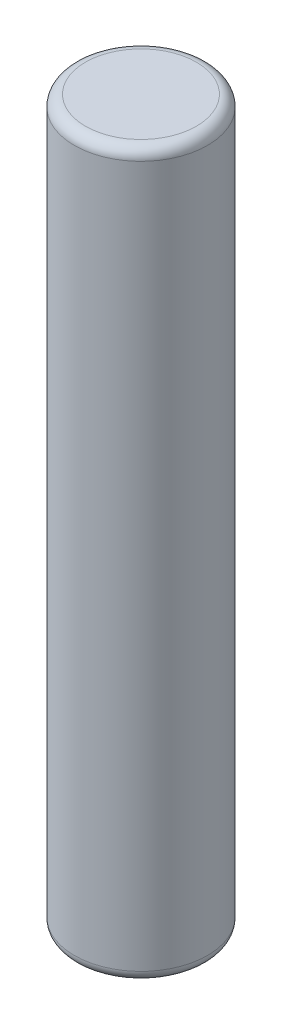
ISO-10303-21;
HEADER;
FILE_DESCRIPTION(('STEP AP214'),'2;1');
FILE_NAME('part.step','',(''),(''),'','','');
FILE_SCHEMA(('AUTOMOTIVE_DESIGN { 1 0 10303 214 1 1 1 1 }'));
ENDSEC;
DATA;
#1=APPLICATION_CONTEXT('core data for automotive mechanical design processes');
#2=APPLICATION_PROTOCOL_DEFINITION('international standard','automotive_design',2000,#1);
#3=PRODUCT_CONTEXT('',#1,'mechanical');
#4=PRODUCT('Part','Part','',(#3));
#5=PRODUCT_RELATED_PRODUCT_CATEGORY('part','',(#4));
#6=PRODUCT_DEFINITION_FORMATION('','',#4);
#7=PRODUCT_DEFINITION_CONTEXT('part definition',#1,'design');
#8=PRODUCT_DEFINITION('design','',#6,#7);
#9=PRODUCT_DEFINITION_SHAPE('','',#8);
#10=(LENGTH_UNIT() NAMED_UNIT(*) SI_UNIT(.MILLI.,.METRE.));
#11=(NAMED_UNIT(*) PLANE_ANGLE_UNIT() SI_UNIT($,.RADIAN.));
#12=(NAMED_UNIT(*) SI_UNIT($,.STERADIAN.) SOLID_ANGLE_UNIT());
#13=UNCERTAINTY_MEASURE_WITH_UNIT(LENGTH_MEASURE(1.E-05),#10,'distance_accuracy_value','');
#14=(GEOMETRIC_REPRESENTATION_CONTEXT(3) GLOBAL_UNCERTAINTY_ASSIGNED_CONTEXT((#13)) GLOBAL_UNIT_ASSIGNED_CONTEXT((#10,
#11,#12)) REPRESENTATION_CONTEXT('',''));
#15=CARTESIAN_POINT('',(0.,0.,0.));
#16=DIRECTION('',(0.,0.,1.));
#17=DIRECTION('',(1.,0.,0.));
#18=AXIS2_PLACEMENT_3D('',#15,#16,#17);
#19=CARTESIAN_POINT('',(16.2500000708053,-4.05409112274651,-11.));
#20=DIRECTION('',(0.,-1.,0.));
#21=DIRECTION('',(1.,0.,0.));
#22=AXIS2_PLACEMENT_3D('',#19,#20,#21);
#23=PLANE('',#22);
#24=CARTESIAN_POINT('',(16.2500000708053,-4.05409112274651,-11.));
#25=DIRECTION('',(0.,-1.,0.));
#26=DIRECTION('',(0.,0.,-1.));
#27=AXIS2_PLACEMENT_3D('',#24,#25,#26);
#28=CIRCLE('',#27,1.25);
#29=CARTESIAN_POINT('',(16.2500000708053,-4.05409112274651,-12.25));
#30=VERTEX_POINT('',#29);
#31=EDGE_CURVE('E65',#30,#30,#28,.T.);
#32=ORIENTED_EDGE('',*,*,#31,.F.);
#33=EDGE_LOOP('',(#32));
#34=FACE_BOUND('',#33,.T.);
#35=ADVANCED_FACE('F15',(#34),#23,.F.);
#36=CARTESIAN_POINT('',(16.2500000708053,-20.354090963304,-11.));
#37=DIRECTION('',(0.,-1.,0.));
#38=DIRECTION('',(1.,0.,0.));
#39=AXIS2_PLACEMENT_3D('',#36,#37,#38);
#40=PLANE('',#39);
#41=CARTESIAN_POINT('',(16.2500000708053,-20.3540909633041,-11.));
#42=DIRECTION('',(0.,1.,0.));
#43=DIRECTION('',(0.,0.,1.));
#44=AXIS2_PLACEMENT_3D('',#41,#42,#43);
#45=CIRCLE('',#44,1.25);
#46=CARTESIAN_POINT('',(16.2500000708053,-20.3540909633041,-9.75));
#47=VERTEX_POINT('',#46);
#48=EDGE_CURVE('E33',#47,#47,#45,.T.);
#49=ORIENTED_EDGE('',*,*,#48,.F.);
#50=EDGE_LOOP('',(#49));
#51=FACE_BOUND('',#50,.T.);
#52=ADVANCED_FACE('F77',(#51),#40,.T.);
#53=CARTESIAN_POINT('',(16.2500000708053,-4.30409112274651,-11.));
#54=DIRECTION('',(0.,1.,0.));
#55=DIRECTION('',(0.,0.,1.));
#56=AXIS2_PLACEMENT_3D('',#53,#54,#55);
#57=TOROIDAL_SURFACE('',#56,1.25,0.25);
#58=CARTESIAN_POINT('',(16.2500000708053,-4.30409112274651,-11.));
#59=DIRECTION('',(0.,1.,0.));
#60=DIRECTION('',(0.,0.,1.));
#61=AXIS2_PLACEMENT_3D('',#58,#59,#60);
#62=CIRCLE('',#61,1.5);
#63=CARTESIAN_POINT('',(16.2500000708053,-4.30409112274651,-9.5));
#64=VERTEX_POINT('',#63);
#65=EDGE_CURVE('E26',#64,#64,#62,.F.);
#66=ORIENTED_EDGE('',*,*,#65,.F.);
#67=EDGE_LOOP('',(#66));
#68=FACE_BOUND('',#67,.T.);
#69=ORIENTED_EDGE('',*,*,#31,.T.);
#70=EDGE_LOOP('',(#69));
#71=FACE_BOUND('',#70,.T.);
#72=ADVANCED_FACE('F46',(#68,#71),#57,.T.);
#73=CARTESIAN_POINT('',(16.2500000708053,-20.1040909633041,-11.));
#74=DIRECTION('',(0.,-1.,0.));
#75=DIRECTION('',(0.,0.,-1.));
#76=AXIS2_PLACEMENT_3D('',#73,#74,#75);
#77=TOROIDAL_SURFACE('',#76,1.25,0.25);
#78=CARTESIAN_POINT('',(16.2500000708053,-20.1040909633041,-11.));
#79=DIRECTION('',(0.,1.,0.));
#80=DIRECTION('',(0.,0.,1.));
#81=AXIS2_PLACEMENT_3D('',#78,#79,#80);
#82=CIRCLE('',#81,1.5);
#83=CARTESIAN_POINT('',(16.2500000708053,-20.1040909633041,-9.5));
#84=VERTEX_POINT('',#83);
#85=EDGE_CURVE('E10',#84,#84,#82,.T.);
#86=ORIENTED_EDGE('',*,*,#85,.F.);
#87=EDGE_LOOP('',(#86));
#88=FACE_BOUND('',#87,.T.);
#89=ORIENTED_EDGE('',*,*,#48,.T.);
#90=EDGE_LOOP('',(#89));
#91=FACE_BOUND('',#90,.T.);
#92=ADVANCED_FACE('F41',(#88,#91),#77,.T.);
#93=CARTESIAN_POINT('',(16.2500000708053,-25.1999999999999,-11.));
#94=DIRECTION('',(0.,1.,0.));
#95=DIRECTION('',(0.,0.,1.));
#96=AXIS2_PLACEMENT_3D('',#93,#94,#95);
#97=CYLINDRICAL_SURFACE('',#96,1.5);
#98=ORIENTED_EDGE('',*,*,#85,.T.);
#99=EDGE_LOOP('',(#98));
#100=FACE_BOUND('',#99,.T.);
#101=ORIENTED_EDGE('',*,*,#65,.T.);
#102=EDGE_LOOP('',(#101));
#103=FACE_BOUND('',#102,.T.);
#104=ADVANCED_FACE('F45',(#100,#103),#97,.T.);
#105=CLOSED_SHELL('',(#35,#52,#72,#92,#104));
#106=MANIFOLD_SOLID_BREP('B1',#105);
#107=ADVANCED_BREP_SHAPE_REPRESENTATION('',(#18,#106),#14);
#108=SHAPE_DEFINITION_REPRESENTATION(#9,#107);
ENDSEC;
END-ISO-10303-21;
